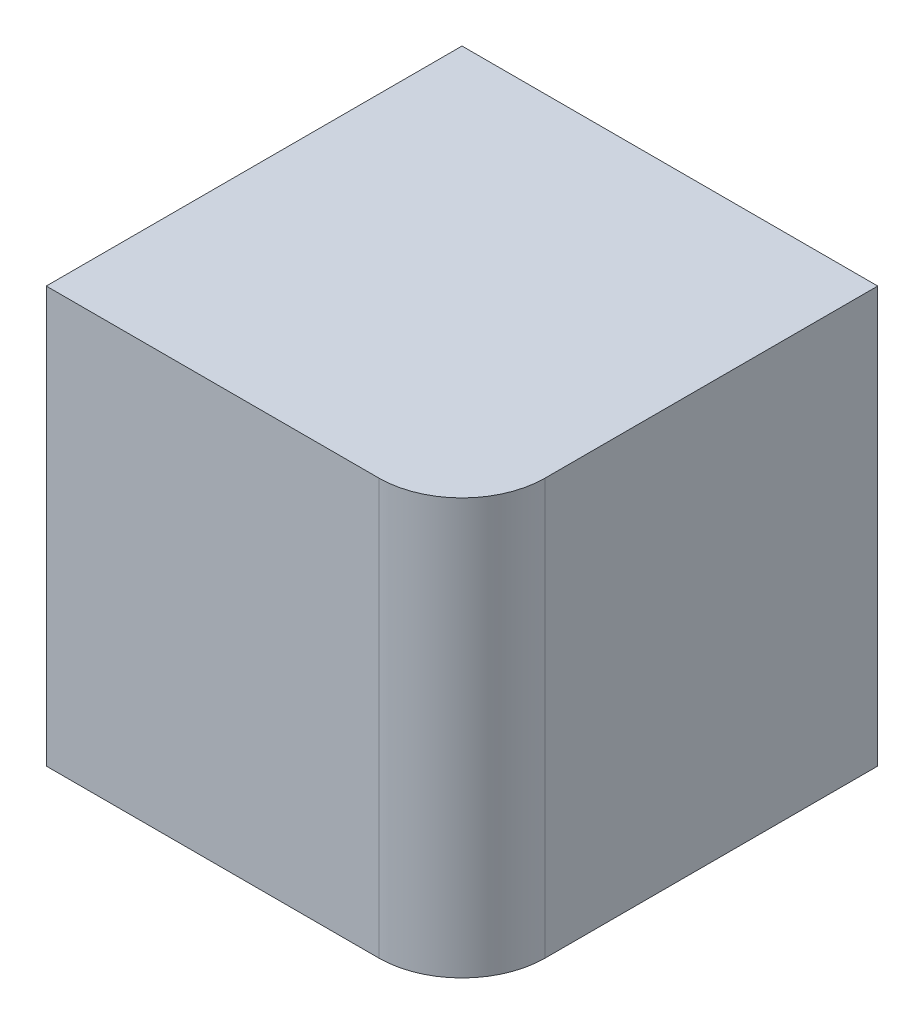
ISO-10303-21;
HEADER;
FILE_DESCRIPTION(('STEP AP214'),'2;1');
FILE_NAME('part.step','',(''),(''),'','','');
FILE_SCHEMA(('AUTOMOTIVE_DESIGN { 1 0 10303 214 1 1 1 1 }'));
ENDSEC;
DATA;
#1=APPLICATION_CONTEXT('core data for automotive mechanical design processes');
#2=APPLICATION_PROTOCOL_DEFINITION('international standard','automotive_design',2000,#1);
#3=PRODUCT_CONTEXT('',#1,'mechanical');
#4=PRODUCT('Part','Part','',(#3));
#5=PRODUCT_RELATED_PRODUCT_CATEGORY('part','',(#4));
#6=PRODUCT_DEFINITION_FORMATION('','',#4);
#7=PRODUCT_DEFINITION_CONTEXT('part definition',#1,'design');
#8=PRODUCT_DEFINITION('design','',#6,#7);
#9=PRODUCT_DEFINITION_SHAPE('','',#8);
#10=(LENGTH_UNIT() NAMED_UNIT(*) SI_UNIT(.MILLI.,.METRE.));
#11=(NAMED_UNIT(*) PLANE_ANGLE_UNIT() SI_UNIT($,.RADIAN.));
#12=(NAMED_UNIT(*) SI_UNIT($,.STERADIAN.) SOLID_ANGLE_UNIT());
#13=UNCERTAINTY_MEASURE_WITH_UNIT(LENGTH_MEASURE(1.E-05),#10,'distance_accuracy_value','');
#14=(GEOMETRIC_REPRESENTATION_CONTEXT(3) GLOBAL_UNCERTAINTY_ASSIGNED_CONTEXT((#13)) GLOBAL_UNIT_ASSIGNED_CONTEXT((#10,
#11,#12)) REPRESENTATION_CONTEXT('',''));
#15=CARTESIAN_POINT('',(0.,0.,0.));
#16=DIRECTION('',(0.,0.,1.));
#17=DIRECTION('',(1.,0.,0.));
#18=AXIS2_PLACEMENT_3D('',#15,#16,#17);
#19=CARTESIAN_POINT('',(0.,0.,10.));
#20=DIRECTION('',(1.,0.,0.));
#21=DIRECTION('',(0.,0.,-1.));
#22=AXIS2_PLACEMENT_3D('',#19,#20,#21);
#23=PLANE('',#22);
#24=DIRECTION('',(0.,-1.,0.));
#25=VECTOR('',#24,1.);
#26=CARTESIAN_POINT('',(0.,0.,0.));
#27=LINE('',#26,#25);
#28=CARTESIAN_POINT('',(0.,10.,0.));
#29=VERTEX_POINT('',#28);
#30=CARTESIAN_POINT('',(0.,0.,0.));
#31=VERTEX_POINT('',#30);
#32=EDGE_CURVE('E109',#29,#31,#27,.T.);
#33=ORIENTED_EDGE('',*,*,#32,.T.);
#34=DIRECTION('',(0.,0.,-1.));
#35=VECTOR('',#34,1.);
#36=CARTESIAN_POINT('',(0.,0.,10.));
#37=LINE('',#36,#35);
#38=CARTESIAN_POINT('',(0.,0.,10.));
#39=VERTEX_POINT('',#38);
#40=EDGE_CURVE('E91',#39,#31,#37,.T.);
#41=ORIENTED_EDGE('',*,*,#40,.F.);
#42=DIRECTION('',(0.,-1.,0.));
#43=VECTOR('',#42,1.);
#44=CARTESIAN_POINT('',(0.,0.,10.));
#45=LINE('',#44,#43);
#46=CARTESIAN_POINT('',(0.,10.,10.));
#47=VERTEX_POINT('',#46);
#48=EDGE_CURVE('E99',#47,#39,#45,.T.);
#49=ORIENTED_EDGE('',*,*,#48,.F.);
#50=DIRECTION('',(0.,0.,-1.));
#51=VECTOR('',#50,1.);
#52=CARTESIAN_POINT('',(0.,10.,10.));
#53=LINE('',#52,#51);
#54=EDGE_CURVE('E116',#47,#29,#53,.T.);
#55=ORIENTED_EDGE('',*,*,#54,.T.);
#56=EDGE_LOOP('',(#33,#41,#49,#55));
#57=FACE_BOUND('',#56,.T.);
#58=ADVANCED_FACE('F43',(#57),#23,.F.);
#59=CARTESIAN_POINT('',(0.,0.,10.));
#60=DIRECTION('',(0.,1.,0.));
#61=DIRECTION('',(0.,0.,1.));
#62=AXIS2_PLACEMENT_3D('',#59,#60,#61);
#63=PLANE('',#62);
#64=DIRECTION('',(0.,0.,-1.));
#65=VECTOR('',#64,1.);
#66=CARTESIAN_POINT('',(10.,0.,10.));
#67=LINE('',#66,#65);
#68=CARTESIAN_POINT('',(10.,0.,8.));
#69=VERTEX_POINT('',#68);
#70=CARTESIAN_POINT('',(10.,0.,0.));
#71=VERTEX_POINT('',#70);
#72=EDGE_CURVE('E115',#69,#71,#67,.T.);
#73=ORIENTED_EDGE('',*,*,#72,.F.);
#74=CARTESIAN_POINT('',(8.,0.,8.));
#75=DIRECTION('',(0.,1.,0.));
#76=DIRECTION('',(0.,0.,1.));
#77=AXIS2_PLACEMENT_3D('',#74,#75,#76);
#78=CIRCLE('',#77,2.);
#79=CARTESIAN_POINT('',(8.,0.,10.));
#80=VERTEX_POINT('',#79);
#81=EDGE_CURVE('E11',#69,#80,#78,.F.);
#82=ORIENTED_EDGE('',*,*,#81,.T.);
#83=DIRECTION('',(1.,0.,0.));
#84=VECTOR('',#83,1.);
#85=CARTESIAN_POINT('',(0.,0.,10.));
#86=LINE('',#85,#84);
#87=EDGE_CURVE('E86',#39,#80,#86,.T.);
#88=ORIENTED_EDGE('',*,*,#87,.F.);
#89=ORIENTED_EDGE('',*,*,#40,.T.);
#90=DIRECTION('',(1.,0.,0.));
#91=VECTOR('',#90,1.);
#92=CARTESIAN_POINT('',(0.,0.,0.));
#93=LINE('',#92,#91);
#94=EDGE_CURVE('E127',#31,#71,#93,.T.);
#95=ORIENTED_EDGE('',*,*,#94,.T.);
#96=EDGE_LOOP('',(#73,#82,#88,#89,#95));
#97=FACE_BOUND('',#96,.T.);
#98=ADVANCED_FACE('F89',(#97),#63,.F.);
#99=CARTESIAN_POINT('',(10.,0.,10.));
#100=DIRECTION('',(-1.,0.,0.));
#101=DIRECTION('',(0.,0.,1.));
#102=AXIS2_PLACEMENT_3D('',#99,#100,#101);
#103=PLANE('',#102);
#104=DIRECTION('',(0.,0.,-1.));
#105=VECTOR('',#104,1.);
#106=CARTESIAN_POINT('',(10.,10.,10.));
#107=LINE('',#106,#105);
#108=CARTESIAN_POINT('',(10.,10.,8.));
#109=VERTEX_POINT('',#108);
#110=CARTESIAN_POINT('',(10.,10.,0.));
#111=VERTEX_POINT('',#110);
#112=EDGE_CURVE('E113',#109,#111,#107,.T.);
#113=ORIENTED_EDGE('',*,*,#112,.F.);
#114=DIRECTION('',(0.,1.,0.));
#115=VECTOR('',#114,1.);
#116=CARTESIAN_POINT('',(10.,0.,8.));
#117=LINE('',#116,#115);
#118=EDGE_CURVE('E51',#109,#69,#117,.F.);
#119=ORIENTED_EDGE('',*,*,#118,.T.);
#120=ORIENTED_EDGE('',*,*,#72,.T.);
#121=DIRECTION('',(0.,1.,0.));
#122=VECTOR('',#121,1.);
#123=CARTESIAN_POINT('',(10.,0.,0.));
#124=LINE('',#123,#122);
#125=EDGE_CURVE('E123',#71,#111,#124,.T.);
#126=ORIENTED_EDGE('',*,*,#125,.T.);
#127=EDGE_LOOP('',(#113,#119,#120,#126));
#128=FACE_BOUND('',#127,.T.);
#129=ADVANCED_FACE('F132',(#128),#103,.F.);
#130=CARTESIAN_POINT('',(0.,10.,10.));
#131=DIRECTION('',(0.,-1.,0.));
#132=DIRECTION('',(0.,0.,-1.));
#133=AXIS2_PLACEMENT_3D('',#130,#131,#132);
#134=PLANE('',#133);
#135=DIRECTION('',(-1.,0.,0.));
#136=VECTOR('',#135,1.);
#137=CARTESIAN_POINT('',(0.,10.,10.));
#138=LINE('',#137,#136);
#139=CARTESIAN_POINT('',(8.,10.,10.));
#140=VERTEX_POINT('',#139);
#141=EDGE_CURVE('E97',#140,#47,#138,.T.);
#142=ORIENTED_EDGE('',*,*,#141,.F.);
#143=CARTESIAN_POINT('',(8.,10.,8.));
#144=DIRECTION('',(0.,-1.,0.));
#145=DIRECTION('',(0.,0.,-1.));
#146=AXIS2_PLACEMENT_3D('',#143,#144,#145);
#147=CIRCLE('',#146,2.);
#148=EDGE_CURVE('E61',#140,#109,#147,.F.);
#149=ORIENTED_EDGE('',*,*,#148,.T.);
#150=ORIENTED_EDGE('',*,*,#112,.T.);
#151=DIRECTION('',(-1.,0.,0.));
#152=VECTOR('',#151,1.);
#153=CARTESIAN_POINT('',(0.,10.,0.));
#154=LINE('',#153,#152);
#155=EDGE_CURVE('E110',#111,#29,#154,.T.);
#156=ORIENTED_EDGE('',*,*,#155,.T.);
#157=ORIENTED_EDGE('',*,*,#54,.F.);
#158=EDGE_LOOP('',(#142,#149,#150,#156,#157));
#159=FACE_BOUND('',#158,.T.);
#160=ADVANCED_FACE('F131',(#159),#134,.F.);
#161=CARTESIAN_POINT('',(0.,0.,10.));
#162=DIRECTION('',(0.,0.,-1.));
#163=DIRECTION('',(-1.,0.,0.));
#164=AXIS2_PLACEMENT_3D('',#161,#162,#163);
#165=PLANE('',#164);
#166=ORIENTED_EDGE('',*,*,#87,.T.);
#167=DIRECTION('',(0.,1.,0.));
#168=VECTOR('',#167,1.);
#169=CARTESIAN_POINT('',(8.,0.,10.));
#170=LINE('',#169,#168);
#171=EDGE_CURVE('E112',#80,#140,#170,.T.);
#172=ORIENTED_EDGE('',*,*,#171,.T.);
#173=ORIENTED_EDGE('',*,*,#141,.T.);
#174=ORIENTED_EDGE('',*,*,#48,.T.);
#175=EDGE_LOOP('',(#166,#172,#173,#174));
#176=FACE_BOUND('',#175,.T.);
#177=ADVANCED_FACE('F103',(#176),#165,.F.);
#178=CARTESIAN_POINT('',(0.,0.,0.));
#179=DIRECTION('',(0.,0.,-1.));
#180=DIRECTION('',(-1.,0.,0.));
#181=AXIS2_PLACEMENT_3D('',#178,#179,#180);
#182=PLANE('',#181);
#183=ORIENTED_EDGE('',*,*,#32,.F.);
#184=ORIENTED_EDGE('',*,*,#155,.F.);
#185=ORIENTED_EDGE('',*,*,#125,.F.);
#186=ORIENTED_EDGE('',*,*,#94,.F.);
#187=EDGE_LOOP('',(#183,#184,#185,#186));
#188=FACE_BOUND('',#187,.T.);
#189=ADVANCED_FACE('F134',(#188),#182,.T.);
#190=CARTESIAN_POINT('',(8.,0.,8.));
#191=DIRECTION('',(0.,1.,0.));
#192=DIRECTION('',(0.,0.,1.));
#193=AXIS2_PLACEMENT_3D('',#190,#191,#192);
#194=CYLINDRICAL_SURFACE('',#193,2.);
#195=ORIENTED_EDGE('',*,*,#81,.F.);
#196=ORIENTED_EDGE('',*,*,#118,.F.);
#197=ORIENTED_EDGE('',*,*,#148,.F.);
#198=ORIENTED_EDGE('',*,*,#171,.F.);
#199=EDGE_LOOP('',(#195,#196,#197,#198));
#200=FACE_BOUND('',#199,.T.);
#201=ADVANCED_FACE('F44',(#200),#194,.T.);
#202=CLOSED_SHELL('',(#58,#98,#129,#160,#177,#189,#201));
#203=MANIFOLD_SOLID_BREP('B2',#202);
#204=ADVANCED_BREP_SHAPE_REPRESENTATION('',(#18,#203),#14);
#205=SHAPE_DEFINITION_REPRESENTATION(#9,#204);
ENDSEC;
END-ISO-10303-21;
